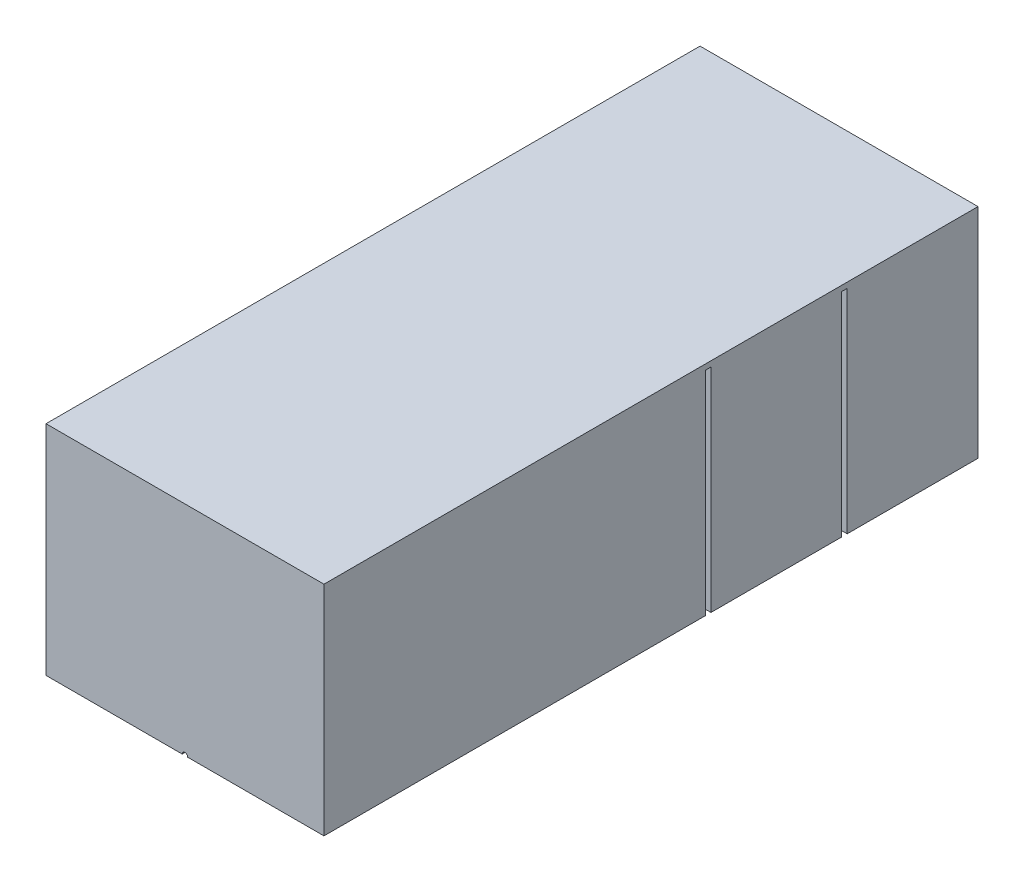
ISO-10303-21;
HEADER;
FILE_DESCRIPTION(('STEP AP214'),'2;1');
FILE_NAME('part.step','',(''),(''),'','','');
FILE_SCHEMA(('AUTOMOTIVE_DESIGN { 1 0 10303 214 1 1 1 1 }'));
ENDSEC;
DATA;
#1=APPLICATION_CONTEXT('core data for automotive mechanical design processes');
#2=APPLICATION_PROTOCOL_DEFINITION('international standard','automotive_design',2000,#1);
#3=PRODUCT_CONTEXT('',#1,'mechanical');
#4=PRODUCT('Part','Part','',(#3));
#5=PRODUCT_RELATED_PRODUCT_CATEGORY('part','',(#4));
#6=PRODUCT_DEFINITION_FORMATION('','',#4);
#7=PRODUCT_DEFINITION_CONTEXT('part definition',#1,'design');
#8=PRODUCT_DEFINITION('design','',#6,#7);
#9=PRODUCT_DEFINITION_SHAPE('','',#8);
#10=(LENGTH_UNIT() NAMED_UNIT(*) SI_UNIT(.MILLI.,.METRE.));
#11=(NAMED_UNIT(*) PLANE_ANGLE_UNIT() SI_UNIT($,.RADIAN.));
#12=(NAMED_UNIT(*) SI_UNIT($,.STERADIAN.) SOLID_ANGLE_UNIT());
#13=UNCERTAINTY_MEASURE_WITH_UNIT(LENGTH_MEASURE(1.E-05),#10,'distance_accuracy_value','');
#14=(GEOMETRIC_REPRESENTATION_CONTEXT(3) GLOBAL_UNCERTAINTY_ASSIGNED_CONTEXT((#13)) GLOBAL_UNIT_ASSIGNED_CONTEXT((#10,
#11,#12)) REPRESENTATION_CONTEXT('',''));
#15=CARTESIAN_POINT('',(0.,0.,0.));
#16=DIRECTION('',(0.,0.,1.));
#17=DIRECTION('',(1.,0.,0.));
#18=AXIS2_PLACEMENT_3D('',#15,#16,#17);
#19=CARTESIAN_POINT('',(56.,29.8959813156576,127.860636733485));
#20=DIRECTION('',(0.,1.,0.));
#21=DIRECTION('',(0.,0.,1.));
#22=AXIS2_PLACEMENT_3D('',#19,#20,#21);
#23=PLANE('',#22);
#24=DIRECTION('',(0.,0.,-1.));
#25=VECTOR('',#24,1.);
#26=CARTESIAN_POINT('',(107.,29.8959813156576,127.860636733485));
#27=LINE('',#26,#25);
#28=CARTESIAN_POINT('',(107.,29.8959813156576,31.8606367334853));
#29=VERTEX_POINT('',#28);
#30=CARTESIAN_POINT('',(107.,29.8959813156576,7.86063673348532));
#31=VERTEX_POINT('',#30);
#32=EDGE_CURVE('E409',#29,#31,#27,.T.);
#33=ORIENTED_EDGE('',*,*,#32,.F.);
#34=DIRECTION('',(1.,0.,0.));
#35=VECTOR('',#34,1.);
#36=CARTESIAN_POINT('',(107.,29.8959813156576,31.8606367334853));
#37=LINE('',#36,#35);
#38=CARTESIAN_POINT('',(56.,29.8959813156576,31.8606367334853));
#39=VERTEX_POINT('',#38);
#40=EDGE_CURVE('E233',#39,#29,#37,.T.);
#41=ORIENTED_EDGE('',*,*,#40,.F.);
#42=DIRECTION('',(0.,0.,-1.));
#43=VECTOR('',#42,1.);
#44=CARTESIAN_POINT('',(56.,29.8959813156576,127.860636733485));
#45=LINE('',#44,#43);
#46=CARTESIAN_POINT('',(56.,29.8959813156576,7.86063673348532));
#47=VERTEX_POINT('',#46);
#48=EDGE_CURVE('E53',#39,#47,#45,.T.);
#49=ORIENTED_EDGE('',*,*,#48,.T.);
#50=DIRECTION('',(1.,0.,0.));
#51=VECTOR('',#50,1.);
#52=CARTESIAN_POINT('',(56.,29.8959813156576,7.86063673348532));
#53=LINE('',#52,#51);
#54=EDGE_CURVE('E399',#47,#31,#53,.T.);
#55=ORIENTED_EDGE('',*,*,#54,.T.);
#56=EDGE_LOOP('',(#33,#41,#49,#55));
#57=FACE_BOUND('',#56,.T.);
#58=ADVANCED_FACE('F44',(#57),#23,.F.);
#59=CARTESIAN_POINT('',(56.,29.8959813156576,56.8606367334853));
#60=VERTEX_POINT('',#59);
#61=CARTESIAN_POINT('',(56.,29.8959813156576,32.8606367334853));
#62=VERTEX_POINT('',#61);
#63=EDGE_CURVE('E52',#60,#62,#45,.T.);
#64=ORIENTED_EDGE('',*,*,#63,.T.);
#65=DIRECTION('',(-1.,0.,0.));
#66=VECTOR('',#65,1.);
#67=CARTESIAN_POINT('',(107.,29.8959813156576,32.8606367334853));
#68=LINE('',#67,#66);
#69=CARTESIAN_POINT('',(107.,29.8959813156576,32.8606367334853));
#70=VERTEX_POINT('',#69);
#71=EDGE_CURVE('E462',#70,#62,#68,.T.);
#72=ORIENTED_EDGE('',*,*,#71,.F.);
#73=CARTESIAN_POINT('',(107.,29.8959813156576,56.8606367334853));
#74=VERTEX_POINT('',#73);
#75=EDGE_CURVE('E239',#74,#70,#27,.T.);
#76=ORIENTED_EDGE('',*,*,#75,.F.);
#77=DIRECTION('',(1.,0.,0.));
#78=VECTOR('',#77,1.);
#79=CARTESIAN_POINT('',(107.,29.8959813156576,56.8606367334853));
#80=LINE('',#79,#78);
#81=EDGE_CURVE('E353',#60,#74,#80,.T.);
#82=ORIENTED_EDGE('',*,*,#81,.F.);
#83=EDGE_LOOP('',(#64,#72,#76,#82));
#84=FACE_BOUND('',#83,.T.);
#85=ADVANCED_FACE('F461',(#84),#23,.F.);
#86=DIRECTION('',(1.,0.,0.));
#87=VECTOR('',#86,1.);
#88=CARTESIAN_POINT('',(59.,29.8959813156576,72.8606367334853));
#89=LINE('',#88,#87);
#90=CARTESIAN_POINT('',(59.,29.8959813156576,72.8606367334853));
#91=VERTEX_POINT('',#90);
#92=CARTESIAN_POINT('',(78.,29.8959813156576,72.8606367334853));
#93=VERTEX_POINT('',#92);
#94=EDGE_CURVE('E332',#91,#93,#89,.T.);
#95=ORIENTED_EDGE('',*,*,#94,.F.);
#96=DIRECTION('',(0.,0.,-1.));
#97=VECTOR('',#96,1.);
#98=CARTESIAN_POINT('',(59.,29.8959813156576,100.415027005272));
#99=LINE('',#98,#97);
#100=CARTESIAN_POINT('',(59.,29.8959813156576,100.415027005272));
#101=VERTEX_POINT('',#100);
#102=EDGE_CURVE('E311',#101,#91,#99,.T.);
#103=ORIENTED_EDGE('',*,*,#102,.F.);
#104=DIRECTION('',(-1.,0.,0.));
#105=VECTOR('',#104,1.);
#106=CARTESIAN_POINT('',(59.,29.8959813156576,100.415027005272));
#107=LINE('',#106,#105);
#108=CARTESIAN_POINT('',(78.,29.8959813156576,100.415027005272));
#109=VERTEX_POINT('',#108);
#110=EDGE_CURVE('E321',#109,#101,#107,.T.);
#111=ORIENTED_EDGE('',*,*,#110,.F.);
#112=DIRECTION('',(0.,0.,1.));
#113=VECTOR('',#112,1.);
#114=CARTESIAN_POINT('',(78.,29.8959813156576,100.415027005272));
#115=LINE('',#114,#113);
#116=EDGE_CURVE('E335',#93,#109,#115,.T.);
#117=ORIENTED_EDGE('',*,*,#116,.F.);
#118=EDGE_LOOP('',(#95,#103,#111,#117));
#119=FACE_BOUND('',#118,.T.);
#120=CARTESIAN_POINT('',(56.,29.8959813156576,127.860636733485));
#121=VERTEX_POINT('',#120);
#122=CARTESIAN_POINT('',(56.,29.8959813156576,57.8606367334853));
#123=VERTEX_POINT('',#122);
#124=EDGE_CURVE('E11',#121,#123,#45,.T.);
#125=ORIENTED_EDGE('',*,*,#124,.T.);
#126=DIRECTION('',(-1.,0.,0.));
#127=VECTOR('',#126,1.);
#128=CARTESIAN_POINT('',(107.,29.8959813156576,57.8606367334853));
#129=LINE('',#128,#127);
#130=CARTESIAN_POINT('',(81.,29.8959813156576,57.8606367334853));
#131=VERTEX_POINT('',#130);
#132=EDGE_CURVE('E342',#131,#123,#129,.T.);
#133=ORIENTED_EDGE('',*,*,#132,.F.);
#134=DIRECTION('',(0.,0.,1.));
#135=VECTOR('',#134,1.);
#136=CARTESIAN_POINT('',(81.,29.8959813156576,57.8606367334853));
#137=LINE('',#136,#135);
#138=CARTESIAN_POINT('',(81.,29.8959813156576,127.860636733485));
#139=VERTEX_POINT('',#138);
#140=EDGE_CURVE('E380',#131,#139,#137,.T.);
#141=ORIENTED_EDGE('',*,*,#140,.T.);
#142=DIRECTION('',(1.,0.,0.));
#143=VECTOR('',#142,1.);
#144=CARTESIAN_POINT('',(56.,29.8959813156576,127.860636733485));
#145=LINE('',#144,#143);
#146=EDGE_CURVE('E389',#121,#139,#145,.T.);
#147=ORIENTED_EDGE('',*,*,#146,.F.);
#148=EDGE_LOOP('',(#125,#133,#141,#147));
#149=FACE_BOUND('',#148,.T.);
#150=ADVANCED_FACE('F448',(#119,#149),#23,.F.);
#151=CARTESIAN_POINT('',(56.,69.8959813156576,127.860636733485));
#152=DIRECTION('',(1.,0.,0.));
#153=DIRECTION('',(0.,1.,0.));
#154=AXIS2_PLACEMENT_3D('',#151,#152,#153);
#155=PLANE('',#154);
#156=ORIENTED_EDGE('',*,*,#48,.F.);
#157=DIRECTION('',(0.,-1.,0.));
#158=VECTOR('',#157,1.);
#159=CARTESIAN_POINT('',(56.,68.8959813156576,31.8606367334853));
#160=LINE('',#159,#158);
#161=CARTESIAN_POINT('',(56.,68.8959813156576,31.8606367334853));
#162=VERTEX_POINT('',#161);
#163=EDGE_CURVE('E241',#162,#39,#160,.T.);
#164=ORIENTED_EDGE('',*,*,#163,.F.);
#165=DIRECTION('',(0.,0.,-1.));
#166=VECTOR('',#165,1.);
#167=CARTESIAN_POINT('',(56.,68.8959813156576,32.8606367334853));
#168=LINE('',#167,#166);
#169=CARTESIAN_POINT('',(56.,68.8959813156576,32.8606367334853));
#170=VERTEX_POINT('',#169);
#171=EDGE_CURVE('E226',#170,#162,#168,.T.);
#172=ORIENTED_EDGE('',*,*,#171,.F.);
#173=DIRECTION('',(0.,-1.,0.));
#174=VECTOR('',#173,1.);
#175=CARTESIAN_POINT('',(56.,68.8959813156576,32.8606367334853));
#176=LINE('',#175,#174);
#177=EDGE_CURVE('E224',#170,#62,#176,.T.);
#178=ORIENTED_EDGE('',*,*,#177,.T.);
#179=ORIENTED_EDGE('',*,*,#63,.F.);
#180=DIRECTION('',(0.,-1.,0.));
#181=VECTOR('',#180,1.);
#182=CARTESIAN_POINT('',(56.,68.8959813156576,56.8606367334853));
#183=LINE('',#182,#181);
#184=CARTESIAN_POINT('',(56.,68.8959813156576,56.8606367334853));
#185=VERTEX_POINT('',#184);
#186=EDGE_CURVE('E368',#185,#60,#183,.T.);
#187=ORIENTED_EDGE('',*,*,#186,.F.);
#188=DIRECTION('',(0.,0.,-1.));
#189=VECTOR('',#188,1.);
#190=CARTESIAN_POINT('',(56.,68.8959813156576,57.8606367334853));
#191=LINE('',#190,#189);
#192=CARTESIAN_POINT('',(56.,68.8959813156576,57.8606367334853));
#193=VERTEX_POINT('',#192);
#194=EDGE_CURVE('E356',#193,#185,#191,.T.);
#195=ORIENTED_EDGE('',*,*,#194,.F.);
#196=DIRECTION('',(0.,-1.,0.));
#197=VECTOR('',#196,1.);
#198=CARTESIAN_POINT('',(56.,68.8959813156576,57.8606367334853));
#199=LINE('',#198,#197);
#200=EDGE_CURVE('E370',#193,#123,#199,.T.);
#201=ORIENTED_EDGE('',*,*,#200,.T.);
#202=ORIENTED_EDGE('',*,*,#124,.F.);
#203=DIRECTION('',(0.,-1.,0.));
#204=VECTOR('',#203,1.);
#205=CARTESIAN_POINT('',(56.,69.8959813156576,127.860636733485));
#206=LINE('',#205,#204);
#207=CARTESIAN_POINT('',(56.,69.8959813156576,127.860636733485));
#208=VERTEX_POINT('',#207);
#209=EDGE_CURVE('E384',#208,#121,#206,.T.);
#210=ORIENTED_EDGE('',*,*,#209,.F.);
#211=DIRECTION('',(0.,0.,-1.));
#212=VECTOR('',#211,1.);
#213=CARTESIAN_POINT('',(56.,69.8959813156576,127.860636733485));
#214=LINE('',#213,#212);
#215=CARTESIAN_POINT('',(56.,69.8959813156576,7.86063673348532));
#216=VERTEX_POINT('',#215);
#217=EDGE_CURVE('E396',#208,#216,#214,.T.);
#218=ORIENTED_EDGE('',*,*,#217,.T.);
#219=DIRECTION('',(0.,-1.,0.));
#220=VECTOR('',#219,1.);
#221=CARTESIAN_POINT('',(56.,69.8959813156576,7.86063673348532));
#222=LINE('',#221,#220);
#223=EDGE_CURVE('E383',#216,#47,#222,.T.);
#224=ORIENTED_EDGE('',*,*,#223,.T.);
#225=EDGE_LOOP('',(#156,#164,#172,#178,#179,#187,#195,#201,#202,#210,#218,#224));
#226=FACE_BOUND('',#225,.T.);
#227=ADVANCED_FACE('F46',(#226),#155,.F.);
#228=DIRECTION('',(1.,0.,0.));
#229=VECTOR('',#228,1.);
#230=CARTESIAN_POINT('',(84.5,29.8959813156576,72.3606367334853));
#231=LINE('',#230,#229);
#232=CARTESIAN_POINT('',(84.5,29.8959813156576,72.3606367334853));
#233=VERTEX_POINT('',#232);
#234=CARTESIAN_POINT('',(104.5,29.8959813156576,72.3606367334853));
#235=VERTEX_POINT('',#234);
#236=EDGE_CURVE('E301',#233,#235,#231,.T.);
#237=ORIENTED_EDGE('',*,*,#236,.F.);
#238=DIRECTION('',(0.,0.,-1.));
#239=VECTOR('',#238,1.);
#240=CARTESIAN_POINT('',(84.5,29.8959813156576,100.915398132448));
#241=LINE('',#240,#239);
#242=CARTESIAN_POINT('',(84.5,29.8959813156576,100.915398132448));
#243=VERTEX_POINT('',#242);
#244=EDGE_CURVE('E68',#243,#233,#241,.T.);
#245=ORIENTED_EDGE('',*,*,#244,.F.);
#246=DIRECTION('',(-1.,0.,0.));
#247=VECTOR('',#246,1.);
#248=CARTESIAN_POINT('',(84.5,29.8959813156576,100.915398132448));
#249=LINE('',#248,#247);
#250=CARTESIAN_POINT('',(104.5,29.8959813156576,100.915398132448));
#251=VERTEX_POINT('',#250);
#252=EDGE_CURVE('E290',#251,#243,#249,.T.);
#253=ORIENTED_EDGE('',*,*,#252,.F.);
#254=DIRECTION('',(0.,0.,1.));
#255=VECTOR('',#254,1.);
#256=CARTESIAN_POINT('',(104.5,29.8959813156576,100.915398132448));
#257=LINE('',#256,#255);
#258=EDGE_CURVE('E304',#235,#251,#257,.T.);
#259=ORIENTED_EDGE('',*,*,#258,.F.);
#260=EDGE_LOOP('',(#237,#245,#253,#259));
#261=FACE_BOUND('',#260,.T.);
#262=DIRECTION('',(0.,0.,1.));
#263=VECTOR('',#262,1.);
#264=CARTESIAN_POINT('',(82.,29.8959813156576,57.8606367334853));
#265=LINE('',#264,#263);
#266=CARTESIAN_POINT('',(82.,29.8959813156576,127.860636733485));
#267=VERTEX_POINT('',#266);
#268=CARTESIAN_POINT('',(82.,29.8959813156576,57.8606367334853));
#269=VERTEX_POINT('',#268);
#270=EDGE_CURVE('E376',#267,#269,#265,.F.);
#271=ORIENTED_EDGE('',*,*,#270,.T.);
#272=CARTESIAN_POINT('',(107.,29.8959813156576,57.8606367334853));
#273=VERTEX_POINT('',#272);
#274=EDGE_CURVE('E362',#273,#269,#129,.T.);
#275=ORIENTED_EDGE('',*,*,#274,.F.);
#276=CARTESIAN_POINT('',(107.,29.8959813156576,127.860636733485));
#277=VERTEX_POINT('',#276);
#278=EDGE_CURVE('E410',#277,#273,#27,.T.);
#279=ORIENTED_EDGE('',*,*,#278,.F.);
#280=EDGE_CURVE('E387',#267,#277,#145,.T.);
#281=ORIENTED_EDGE('',*,*,#280,.F.);
#282=EDGE_LOOP('',(#271,#275,#279,#281));
#283=FACE_BOUND('',#282,.T.);
#284=ADVANCED_FACE('F439',(#261,#283),#23,.F.);
#285=CARTESIAN_POINT('',(107.,69.8959813156576,127.860636733485));
#286=DIRECTION('',(-1.,0.,0.));
#287=DIRECTION('',(0.,-1.,0.));
#288=AXIS2_PLACEMENT_3D('',#285,#286,#287);
#289=PLANE('',#288);
#290=DIRECTION('',(0.,0.,1.));
#291=VECTOR('',#290,1.);
#292=CARTESIAN_POINT('',(107.,68.8959813156576,32.8606367334853));
#293=LINE('',#292,#291);
#294=CARTESIAN_POINT('',(107.,68.8959813156576,31.8606367334853));
#295=VERTEX_POINT('',#294);
#296=CARTESIAN_POINT('',(107.,68.8959813156576,32.8606367334853));
#297=VERTEX_POINT('',#296);
#298=EDGE_CURVE('E227',#295,#297,#293,.T.);
#299=ORIENTED_EDGE('',*,*,#298,.F.);
#300=DIRECTION('',(0.,-1.,0.));
#301=VECTOR('',#300,1.);
#302=CARTESIAN_POINT('',(107.,68.8959813156576,31.8606367334853));
#303=LINE('',#302,#301);
#304=EDGE_CURVE('E253',#295,#29,#303,.T.);
#305=ORIENTED_EDGE('',*,*,#304,.T.);
#306=ORIENTED_EDGE('',*,*,#32,.T.);
#307=DIRECTION('',(0.,1.,0.));
#308=VECTOR('',#307,1.);
#309=CARTESIAN_POINT('',(107.,69.8959813156576,7.86063673348532));
#310=LINE('',#309,#308);
#311=CARTESIAN_POINT('',(107.,69.8959813156576,7.86063673348532));
#312=VERTEX_POINT('',#311);
#313=EDGE_CURVE('E402',#31,#312,#310,.T.);
#314=ORIENTED_EDGE('',*,*,#313,.T.);
#315=DIRECTION('',(0.,0.,-1.));
#316=VECTOR('',#315,1.);
#317=CARTESIAN_POINT('',(107.,69.8959813156576,127.860636733485));
#318=LINE('',#317,#316);
#319=CARTESIAN_POINT('',(107.,69.8959813156576,127.860636733485));
#320=VERTEX_POINT('',#319);
#321=EDGE_CURVE('E407',#320,#312,#318,.T.);
#322=ORIENTED_EDGE('',*,*,#321,.F.);
#323=DIRECTION('',(0.,1.,0.));
#324=VECTOR('',#323,1.);
#325=CARTESIAN_POINT('',(107.,69.8959813156576,127.860636733485));
#326=LINE('',#325,#324);
#327=EDGE_CURVE('E392',#277,#320,#326,.T.);
#328=ORIENTED_EDGE('',*,*,#327,.F.);
#329=ORIENTED_EDGE('',*,*,#278,.T.);
#330=DIRECTION('',(0.,-1.,0.));
#331=VECTOR('',#330,1.);
#332=CARTESIAN_POINT('',(107.,68.8959813156576,57.8606367334853));
#333=LINE('',#332,#331);
#334=CARTESIAN_POINT('',(107.,68.8959813156576,57.8606367334853));
#335=VERTEX_POINT('',#334);
#336=EDGE_CURVE('E361',#335,#273,#333,.T.);
#337=ORIENTED_EDGE('',*,*,#336,.F.);
#338=DIRECTION('',(0.,0.,1.));
#339=VECTOR('',#338,1.);
#340=CARTESIAN_POINT('',(107.,68.8959813156576,57.8606367334853));
#341=LINE('',#340,#339);
#342=CARTESIAN_POINT('',(107.,68.8959813156576,56.8606367334853));
#343=VERTEX_POINT('',#342);
#344=EDGE_CURVE('E349',#343,#335,#341,.T.);
#345=ORIENTED_EDGE('',*,*,#344,.F.);
#346=DIRECTION('',(0.,-1.,0.));
#347=VECTOR('',#346,1.);
#348=CARTESIAN_POINT('',(107.,68.8959813156576,56.8606367334853));
#349=LINE('',#348,#347);
#350=EDGE_CURVE('E365',#343,#74,#349,.T.);
#351=ORIENTED_EDGE('',*,*,#350,.T.);
#352=ORIENTED_EDGE('',*,*,#75,.T.);
#353=DIRECTION('',(0.,-1.,0.));
#354=VECTOR('',#353,1.);
#355=CARTESIAN_POINT('',(107.,68.8959813156576,32.8606367334853));
#356=LINE('',#355,#354);
#357=EDGE_CURVE('E221',#297,#70,#356,.T.);
#358=ORIENTED_EDGE('',*,*,#357,.F.);
#359=EDGE_LOOP('',(#299,#305,#306,#314,#322,#328,#329,#337,#345,#351,#352,#358));
#360=FACE_BOUND('',#359,.T.);
#361=ADVANCED_FACE('F236',(#360),#289,.F.);
#362=CARTESIAN_POINT('',(56.,69.8959813156576,127.860636733485));
#363=DIRECTION('',(0.,-1.,0.));
#364=DIRECTION('',(0.,0.,-1.));
#365=AXIS2_PLACEMENT_3D('',#362,#363,#364);
#366=PLANE('',#365);
#367=DIRECTION('',(-1.,0.,0.));
#368=VECTOR('',#367,1.);
#369=CARTESIAN_POINT('',(56.,69.8959813156576,7.86063673348532));
#370=LINE('',#369,#368);
#371=EDGE_CURVE('E388',#312,#216,#370,.T.);
#372=ORIENTED_EDGE('',*,*,#371,.T.);
#373=ORIENTED_EDGE('',*,*,#217,.F.);
#374=DIRECTION('',(-1.,0.,0.));
#375=VECTOR('',#374,1.);
#376=CARTESIAN_POINT('',(56.,69.8959813156576,127.860636733485));
#377=LINE('',#376,#375);
#378=EDGE_CURVE('E394',#320,#208,#377,.T.);
#379=ORIENTED_EDGE('',*,*,#378,.F.);
#380=ORIENTED_EDGE('',*,*,#321,.T.);
#381=EDGE_LOOP('',(#372,#373,#379,#380));
#382=FACE_BOUND('',#381,.T.);
#383=ADVANCED_FACE('F428',(#382),#366,.F.);
#384=CARTESIAN_POINT('',(0.,0.,127.860636733485));
#385=DIRECTION('',(0.,0.,1.));
#386=DIRECTION('',(1.,0.,0.));
#387=AXIS2_PLACEMENT_3D('',#384,#385,#386);
#388=PLANE('',#387);
#389=CARTESIAN_POINT('',(81.5,29.8959813156576,127.860636733485));
#390=DIRECTION('',(0.,0.,1.));
#391=DIRECTION('',(1.,0.,0.));
#392=AXIS2_PLACEMENT_3D('',#389,#390,#391);
#393=CIRCLE('',#392,0.499999999999999);
#394=EDGE_CURVE('E367',#267,#139,#393,.T.);
#395=ORIENTED_EDGE('',*,*,#394,.F.);
#396=ORIENTED_EDGE('',*,*,#280,.T.);
#397=ORIENTED_EDGE('',*,*,#327,.T.);
#398=ORIENTED_EDGE('',*,*,#378,.T.);
#399=ORIENTED_EDGE('',*,*,#209,.T.);
#400=ORIENTED_EDGE('',*,*,#146,.T.);
#401=EDGE_LOOP('',(#395,#396,#397,#398,#399,#400));
#402=FACE_BOUND('',#401,.T.);
#403=ADVANCED_FACE('F435',(#402),#388,.T.);
#404=CARTESIAN_POINT('',(0.,0.,7.86063673348532));
#405=DIRECTION('',(0.,0.,1.));
#406=DIRECTION('',(1.,0.,0.));
#407=AXIS2_PLACEMENT_3D('',#404,#405,#406);
#408=PLANE('',#407);
#409=ORIENTED_EDGE('',*,*,#223,.F.);
#410=ORIENTED_EDGE('',*,*,#371,.F.);
#411=ORIENTED_EDGE('',*,*,#313,.F.);
#412=ORIENTED_EDGE('',*,*,#54,.F.);
#413=EDGE_LOOP('',(#409,#410,#411,#412));
#414=FACE_BOUND('',#413,.T.);
#415=ADVANCED_FACE('F425',(#414),#408,.F.);
#416=CARTESIAN_POINT('',(81.5,29.8959813156576,57.8606367334853));
#417=DIRECTION('',(0.,0.,1.));
#418=DIRECTION('',(1.,0.,0.));
#419=AXIS2_PLACEMENT_3D('',#416,#417,#418);
#420=CYLINDRICAL_SURFACE('',#419,0.499999999999999);
#421=CARTESIAN_POINT('',(81.5,29.8959813156576,57.8606367334853));
#422=DIRECTION('',(0.,0.,1.));
#423=DIRECTION('',(1.,0.,0.));
#424=AXIS2_PLACEMENT_3D('',#421,#422,#423);
#425=CIRCLE('',#424,0.499999999999999);
#426=EDGE_CURVE('E374',#269,#131,#425,.T.);
#427=ORIENTED_EDGE('',*,*,#426,.F.);
#428=ORIENTED_EDGE('',*,*,#270,.F.);
#429=ORIENTED_EDGE('',*,*,#394,.T.);
#430=ORIENTED_EDGE('',*,*,#140,.F.);
#431=EDGE_LOOP('',(#427,#428,#429,#430));
#432=FACE_BOUND('',#431,.T.);
#433=ADVANCED_FACE('F446',(#432),#420,.F.);
#434=CARTESIAN_POINT('',(107.,68.8959813156576,57.8606367334853));
#435=DIRECTION('',(0.,0.,1.));
#436=DIRECTION('',(1.,0.,0.));
#437=AXIS2_PLACEMENT_3D('',#434,#435,#436);
#438=PLANE('',#437);
#439=ORIENTED_EDGE('',*,*,#132,.T.);
#440=ORIENTED_EDGE('',*,*,#200,.F.);
#441=DIRECTION('',(-1.,0.,0.));
#442=VECTOR('',#441,1.);
#443=CARTESIAN_POINT('',(107.,68.8959813156576,57.8606367334853));
#444=LINE('',#443,#442);
#445=EDGE_CURVE('E352',#335,#193,#444,.T.);
#446=ORIENTED_EDGE('',*,*,#445,.F.);
#447=ORIENTED_EDGE('',*,*,#336,.T.);
#448=ORIENTED_EDGE('',*,*,#274,.T.);
#449=ORIENTED_EDGE('',*,*,#426,.T.);
#450=EDGE_LOOP('',(#439,#440,#446,#447,#448,#449));
#451=FACE_BOUND('',#450,.T.);
#452=ADVANCED_FACE('F442',(#451),#438,.F.);
#453=CARTESIAN_POINT('',(107.,68.8959813156576,56.8606367334853));
#454=DIRECTION('',(0.,0.,-1.));
#455=DIRECTION('',(-1.,0.,0.));
#456=AXIS2_PLACEMENT_3D('',#453,#454,#455);
#457=PLANE('',#456);
#458=ORIENTED_EDGE('',*,*,#81,.T.);
#459=ORIENTED_EDGE('',*,*,#350,.F.);
#460=DIRECTION('',(1.,0.,0.));
#461=VECTOR('',#460,1.);
#462=CARTESIAN_POINT('',(107.,68.8959813156576,56.8606367334853));
#463=LINE('',#462,#461);
#464=EDGE_CURVE('E358',#185,#343,#463,.T.);
#465=ORIENTED_EDGE('',*,*,#464,.F.);
#466=ORIENTED_EDGE('',*,*,#186,.T.);
#467=EDGE_LOOP('',(#458,#459,#465,#466));
#468=FACE_BOUND('',#467,.T.);
#469=ADVANCED_FACE('F457',(#468),#457,.F.);
#470=CARTESIAN_POINT('',(0.,68.8959813156576,0.));
#471=DIRECTION('',(0.,1.,0.));
#472=DIRECTION('',(0.,0.,1.));
#473=AXIS2_PLACEMENT_3D('',#470,#471,#472);
#474=PLANE('',#473);
#475=ORIENTED_EDGE('',*,*,#344,.T.);
#476=ORIENTED_EDGE('',*,*,#445,.T.);
#477=ORIENTED_EDGE('',*,*,#194,.T.);
#478=ORIENTED_EDGE('',*,*,#464,.T.);
#479=EDGE_LOOP('',(#475,#476,#477,#478));
#480=FACE_BOUND('',#479,.T.);
#481=ADVANCED_FACE('F454',(#480),#474,.F.);
#482=CARTESIAN_POINT('',(59.,44.8959813156576,100.415027005272));
#483=DIRECTION('',(-1.,0.,0.));
#484=DIRECTION('',(0.,0.,1.));
#485=AXIS2_PLACEMENT_3D('',#482,#483,#484);
#486=PLANE('',#485);
#487=ORIENTED_EDGE('',*,*,#102,.T.);
#488=DIRECTION('',(0.,-1.,0.));
#489=VECTOR('',#488,1.);
#490=CARTESIAN_POINT('',(59.,44.8959813156576,72.8606367334853));
#491=LINE('',#490,#489);
#492=CARTESIAN_POINT('',(59.,44.8959813156576,72.8606367334853));
#493=VERTEX_POINT('',#492);
#494=EDGE_CURVE('E330',#493,#91,#491,.T.);
#495=ORIENTED_EDGE('',*,*,#494,.F.);
#496=DIRECTION('',(0.,0.,-1.));
#497=VECTOR('',#496,1.);
#498=CARTESIAN_POINT('',(59.,44.8959813156576,100.415027005272));
#499=LINE('',#498,#497);
#500=CARTESIAN_POINT('',(59.,44.8959813156576,100.415027005272));
#501=VERTEX_POINT('',#500);
#502=EDGE_CURVE('E317',#501,#493,#499,.T.);
#503=ORIENTED_EDGE('',*,*,#502,.F.);
#504=DIRECTION('',(0.,-1.,0.));
#505=VECTOR('',#504,1.);
#506=CARTESIAN_POINT('',(59.,44.8959813156576,100.415027005272));
#507=LINE('',#506,#505);
#508=EDGE_CURVE('E340',#501,#101,#507,.T.);
#509=ORIENTED_EDGE('',*,*,#508,.T.);
#510=EDGE_LOOP('',(#487,#495,#503,#509));
#511=FACE_BOUND('',#510,.T.);
#512=ADVANCED_FACE('F511',(#511),#486,.F.);
#513=CARTESIAN_POINT('',(59.,44.8959813156576,100.415027005272));
#514=DIRECTION('',(0.,0.,1.));
#515=DIRECTION('',(1.,0.,0.));
#516=AXIS2_PLACEMENT_3D('',#513,#514,#515);
#517=PLANE('',#516);
#518=ORIENTED_EDGE('',*,*,#110,.T.);
#519=ORIENTED_EDGE('',*,*,#508,.F.);
#520=DIRECTION('',(-1.,0.,0.));
#521=VECTOR('',#520,1.);
#522=CARTESIAN_POINT('',(59.,44.8959813156576,100.415027005272));
#523=LINE('',#522,#521);
#524=CARTESIAN_POINT('',(78.,44.8959813156576,100.415027005272));
#525=VERTEX_POINT('',#524);
#526=EDGE_CURVE('E327',#525,#501,#523,.T.);
#527=ORIENTED_EDGE('',*,*,#526,.F.);
#528=DIRECTION('',(0.,-1.,0.));
#529=VECTOR('',#528,1.);
#530=CARTESIAN_POINT('',(78.,44.8959813156576,100.415027005272));
#531=LINE('',#530,#529);
#532=EDGE_CURVE('E343',#525,#109,#531,.T.);
#533=ORIENTED_EDGE('',*,*,#532,.T.);
#534=EDGE_LOOP('',(#518,#519,#527,#533));
#535=FACE_BOUND('',#534,.T.);
#536=ADVANCED_FACE('F514',(#535),#517,.F.);
#537=CARTESIAN_POINT('',(78.,44.8959813156576,100.415027005272));
#538=DIRECTION('',(1.,0.,0.));
#539=DIRECTION('',(0.,0.,-1.));
#540=AXIS2_PLACEMENT_3D('',#537,#538,#539);
#541=PLANE('',#540);
#542=ORIENTED_EDGE('',*,*,#116,.T.);
#543=ORIENTED_EDGE('',*,*,#532,.F.);
#544=DIRECTION('',(0.,0.,1.));
#545=VECTOR('',#544,1.);
#546=CARTESIAN_POINT('',(78.,44.8959813156576,100.415027005272));
#547=LINE('',#546,#545);
#548=CARTESIAN_POINT('',(78.,44.8959813156576,72.8606367334853));
#549=VERTEX_POINT('',#548);
#550=EDGE_CURVE('E324',#549,#525,#547,.T.);
#551=ORIENTED_EDGE('',*,*,#550,.F.);
#552=DIRECTION('',(0.,-1.,0.));
#553=VECTOR('',#552,1.);
#554=CARTESIAN_POINT('',(78.,44.8959813156576,72.8606367334853));
#555=LINE('',#554,#553);
#556=EDGE_CURVE('E345',#549,#93,#555,.T.);
#557=ORIENTED_EDGE('',*,*,#556,.T.);
#558=EDGE_LOOP('',(#542,#543,#551,#557));
#559=FACE_BOUND('',#558,.T.);
#560=ADVANCED_FACE('F516',(#559),#541,.F.);
#561=CARTESIAN_POINT('',(59.,44.8959813156576,72.8606367334853));
#562=DIRECTION('',(0.,0.,-1.));
#563=DIRECTION('',(-1.,0.,0.));
#564=AXIS2_PLACEMENT_3D('',#561,#562,#563);
#565=PLANE('',#564);
#566=ORIENTED_EDGE('',*,*,#94,.T.);
#567=ORIENTED_EDGE('',*,*,#556,.F.);
#568=DIRECTION('',(1.,0.,0.));
#569=VECTOR('',#568,1.);
#570=CARTESIAN_POINT('',(59.,44.8959813156576,72.8606367334853));
#571=LINE('',#570,#569);
#572=EDGE_CURVE('E320',#493,#549,#571,.T.);
#573=ORIENTED_EDGE('',*,*,#572,.F.);
#574=ORIENTED_EDGE('',*,*,#494,.T.);
#575=EDGE_LOOP('',(#566,#567,#573,#574));
#576=FACE_BOUND('',#575,.T.);
#577=ADVANCED_FACE('F506',(#576),#565,.F.);
#578=CARTESIAN_POINT('',(0.,44.8959813156576,0.));
#579=DIRECTION('',(0.,-1.,0.));
#580=DIRECTION('',(0.,0.,-1.));
#581=AXIS2_PLACEMENT_3D('',#578,#579,#580);
#582=PLANE('',#581);
#583=ORIENTED_EDGE('',*,*,#502,.T.);
#584=ORIENTED_EDGE('',*,*,#572,.T.);
#585=ORIENTED_EDGE('',*,*,#550,.T.);
#586=ORIENTED_EDGE('',*,*,#526,.T.);
#587=EDGE_LOOP('',(#583,#584,#585,#586));
#588=FACE_BOUND('',#587,.T.);
#589=ADVANCED_FACE('F518',(#588),#582,.T.);
#590=CARTESIAN_POINT('',(84.5,30.8959813156576,100.915398132448));
#591=DIRECTION('',(-1.,0.,0.));
#592=DIRECTION('',(0.,0.,1.));
#593=AXIS2_PLACEMENT_3D('',#590,#591,#592);
#594=PLANE('',#593);
#595=ORIENTED_EDGE('',*,*,#244,.T.);
#596=DIRECTION('',(0.,-1.,0.));
#597=VECTOR('',#596,1.);
#598=CARTESIAN_POINT('',(84.5,30.8959813156576,72.3606367334853));
#599=LINE('',#598,#597);
#600=CARTESIAN_POINT('',(84.5,30.8959813156576,72.3606367334853));
#601=VERTEX_POINT('',#600);
#602=EDGE_CURVE('E299',#601,#233,#599,.T.);
#603=ORIENTED_EDGE('',*,*,#602,.F.);
#604=DIRECTION('',(0.,0.,-1.));
#605=VECTOR('',#604,1.);
#606=CARTESIAN_POINT('',(84.5,30.8959813156576,100.915398132448));
#607=LINE('',#606,#605);
#608=CARTESIAN_POINT('',(84.5,30.8959813156576,100.915398132448));
#609=VERTEX_POINT('',#608);
#610=EDGE_CURVE('E286',#609,#601,#607,.T.);
#611=ORIENTED_EDGE('',*,*,#610,.F.);
#612=DIRECTION('',(0.,-1.,0.));
#613=VECTOR('',#612,1.);
#614=CARTESIAN_POINT('',(84.5,30.8959813156576,100.915398132448));
#615=LINE('',#614,#613);
#616=EDGE_CURVE('E309',#609,#243,#615,.T.);
#617=ORIENTED_EDGE('',*,*,#616,.T.);
#618=EDGE_LOOP('',(#595,#603,#611,#617));
#619=FACE_BOUND('',#618,.T.);
#620=ADVANCED_FACE('F520',(#619),#594,.F.);
#621=CARTESIAN_POINT('',(84.5,30.8959813156576,100.915398132448));
#622=DIRECTION('',(0.,0.,1.));
#623=DIRECTION('',(1.,0.,0.));
#624=AXIS2_PLACEMENT_3D('',#621,#622,#623);
#625=PLANE('',#624);
#626=ORIENTED_EDGE('',*,*,#252,.T.);
#627=ORIENTED_EDGE('',*,*,#616,.F.);
#628=DIRECTION('',(-1.,0.,0.));
#629=VECTOR('',#628,1.);
#630=CARTESIAN_POINT('',(84.5,30.8959813156576,100.915398132448));
#631=LINE('',#630,#629);
#632=CARTESIAN_POINT('',(104.5,30.8959813156576,100.915398132448));
#633=VERTEX_POINT('',#632);
#634=EDGE_CURVE('E296',#633,#609,#631,.T.);
#635=ORIENTED_EDGE('',*,*,#634,.F.);
#636=DIRECTION('',(0.,-1.,0.));
#637=VECTOR('',#636,1.);
#638=CARTESIAN_POINT('',(104.5,30.8959813156576,100.915398132448));
#639=LINE('',#638,#637);
#640=EDGE_CURVE('E312',#633,#251,#639,.T.);
#641=ORIENTED_EDGE('',*,*,#640,.T.);
#642=EDGE_LOOP('',(#626,#627,#635,#641));
#643=FACE_BOUND('',#642,.T.);
#644=ADVANCED_FACE('F526',(#643),#625,.F.);
#645=CARTESIAN_POINT('',(104.5,30.8959813156576,100.915398132448));
#646=DIRECTION('',(1.,0.,0.));
#647=DIRECTION('',(0.,0.,-1.));
#648=AXIS2_PLACEMENT_3D('',#645,#646,#647);
#649=PLANE('',#648);
#650=ORIENTED_EDGE('',*,*,#258,.T.);
#651=ORIENTED_EDGE('',*,*,#640,.F.);
#652=DIRECTION('',(0.,0.,1.));
#653=VECTOR('',#652,1.);
#654=CARTESIAN_POINT('',(104.5,30.8959813156576,100.915398132448));
#655=LINE('',#654,#653);
#656=CARTESIAN_POINT('',(104.5,30.8959813156576,72.3606367334853));
#657=VERTEX_POINT('',#656);
#658=EDGE_CURVE('E293',#657,#633,#655,.T.);
#659=ORIENTED_EDGE('',*,*,#658,.F.);
#660=DIRECTION('',(0.,-1.,0.));
#661=VECTOR('',#660,1.);
#662=CARTESIAN_POINT('',(104.5,30.8959813156576,72.3606367334853));
#663=LINE('',#662,#661);
#664=EDGE_CURVE('E314',#657,#235,#663,.T.);
#665=ORIENTED_EDGE('',*,*,#664,.T.);
#666=EDGE_LOOP('',(#650,#651,#659,#665));
#667=FACE_BOUND('',#666,.T.);
#668=ADVANCED_FACE('F627',(#667),#649,.F.);
#669=CARTESIAN_POINT('',(84.5,30.8959813156576,72.3606367334853));
#670=DIRECTION('',(0.,0.,-1.));
#671=DIRECTION('',(-1.,0.,0.));
#672=AXIS2_PLACEMENT_3D('',#669,#670,#671);
#673=PLANE('',#672);
#674=ORIENTED_EDGE('',*,*,#236,.T.);
#675=ORIENTED_EDGE('',*,*,#664,.F.);
#676=DIRECTION('',(1.,0.,0.));
#677=VECTOR('',#676,1.);
#678=CARTESIAN_POINT('',(84.5,30.8959813156576,72.3606367334853));
#679=LINE('',#678,#677);
#680=EDGE_CURVE('E289',#601,#657,#679,.T.);
#681=ORIENTED_EDGE('',*,*,#680,.F.);
#682=ORIENTED_EDGE('',*,*,#602,.T.);
#683=EDGE_LOOP('',(#674,#675,#681,#682));
#684=FACE_BOUND('',#683,.T.);
#685=ADVANCED_FACE('F638',(#684),#673,.F.);
#686=CARTESIAN_POINT('',(0.,30.8959813156576,0.));
#687=DIRECTION('',(0.,-1.,0.));
#688=DIRECTION('',(0.,0.,-1.));
#689=AXIS2_PLACEMENT_3D('',#686,#687,#688);
#690=PLANE('',#689);
#691=DIRECTION('',(-1.,0.,0.));
#692=VECTOR('',#691,1.);
#693=CARTESIAN_POINT('',(85.,30.8959813156576,100.415398132448));
#694=LINE('',#693,#692);
#695=CARTESIAN_POINT('',(104.,30.8959813156576,100.415398132448));
#696=VERTEX_POINT('',#695);
#697=CARTESIAN_POINT('',(85.,30.8959813156576,100.415398132448));
#698=VERTEX_POINT('',#697);
#699=EDGE_CURVE('E264',#696,#698,#694,.T.);
#700=ORIENTED_EDGE('',*,*,#699,.F.);
#701=DIRECTION('',(0.,0.,1.));
#702=VECTOR('',#701,1.);
#703=CARTESIAN_POINT('',(104.,30.8959813156576,100.415398132448));
#704=LINE('',#703,#702);
#705=CARTESIAN_POINT('',(104.,30.8959813156576,72.8606367334853));
#706=VERTEX_POINT('',#705);
#707=EDGE_CURVE('E261',#706,#696,#704,.T.);
#708=ORIENTED_EDGE('',*,*,#707,.F.);
#709=DIRECTION('',(1.,0.,0.));
#710=VECTOR('',#709,1.);
#711=CARTESIAN_POINT('',(85.,30.8959813156576,72.8606367334853));
#712=LINE('',#711,#710);
#713=CARTESIAN_POINT('',(85.,30.8959813156576,72.8606367334853));
#714=VERTEX_POINT('',#713);
#715=EDGE_CURVE('E257',#714,#706,#712,.T.);
#716=ORIENTED_EDGE('',*,*,#715,.F.);
#717=DIRECTION('',(0.,0.,-1.));
#718=VECTOR('',#717,1.);
#719=CARTESIAN_POINT('',(85.,30.8959813156576,100.415398132448));
#720=LINE('',#719,#718);
#721=EDGE_CURVE('E254',#698,#714,#720,.T.);
#722=ORIENTED_EDGE('',*,*,#721,.F.);
#723=EDGE_LOOP('',(#700,#708,#716,#722));
#724=FACE_BOUND('',#723,.T.);
#725=ORIENTED_EDGE('',*,*,#610,.T.);
#726=ORIENTED_EDGE('',*,*,#680,.T.);
#727=ORIENTED_EDGE('',*,*,#658,.T.);
#728=ORIENTED_EDGE('',*,*,#634,.T.);
#729=EDGE_LOOP('',(#725,#726,#727,#728));
#730=FACE_BOUND('',#729,.T.);
#731=ADVANCED_FACE('F649',(#724,#730),#690,.T.);
#732=CARTESIAN_POINT('',(85.,30.8959813156576,100.415398132448));
#733=DIRECTION('',(-1.,0.,0.));
#734=DIRECTION('',(0.,0.,1.));
#735=AXIS2_PLACEMENT_3D('',#732,#733,#734);
#736=PLANE('',#735);
#737=DIRECTION('',(0.,0.,-1.));
#738=VECTOR('',#737,1.);
#739=CARTESIAN_POINT('',(85.,29.8959813156576,100.415398132448));
#740=LINE('',#739,#738);
#741=CARTESIAN_POINT('',(85.,29.8959813156576,100.415398132448));
#742=VERTEX_POINT('',#741);
#743=CARTESIAN_POINT('',(85.,29.8959813156576,72.8606367334853));
#744=VERTEX_POINT('',#743);
#745=EDGE_CURVE('E249',#742,#744,#740,.T.);
#746=ORIENTED_EDGE('',*,*,#745,.F.);
#747=DIRECTION('',(0.,-1.,0.));
#748=VECTOR('',#747,1.);
#749=CARTESIAN_POINT('',(85.,30.8959813156576,100.415398132448));
#750=LINE('',#749,#748);
#751=EDGE_CURVE('E278',#698,#742,#750,.T.);
#752=ORIENTED_EDGE('',*,*,#751,.F.);
#753=ORIENTED_EDGE('',*,*,#721,.T.);
#754=DIRECTION('',(0.,-1.,0.));
#755=VECTOR('',#754,1.);
#756=CARTESIAN_POINT('',(85.,30.8959813156576,72.8606367334853));
#757=LINE('',#756,#755);
#758=EDGE_CURVE('E267',#714,#744,#757,.T.);
#759=ORIENTED_EDGE('',*,*,#758,.T.);
#760=EDGE_LOOP('',(#746,#752,#753,#759));
#761=FACE_BOUND('',#760,.T.);
#762=ADVANCED_FACE('F659',(#761),#736,.T.);
#763=CARTESIAN_POINT('',(85.,30.8959813156576,100.415398132448));
#764=DIRECTION('',(0.,0.,1.));
#765=DIRECTION('',(1.,0.,0.));
#766=AXIS2_PLACEMENT_3D('',#763,#764,#765);
#767=PLANE('',#766);
#768=DIRECTION('',(-1.,0.,0.));
#769=VECTOR('',#768,1.);
#770=CARTESIAN_POINT('',(85.,29.8959813156576,100.415398132448));
#771=LINE('',#770,#769);
#772=CARTESIAN_POINT('',(104.,29.8959813156576,100.415398132448));
#773=VERTEX_POINT('',#772);
#774=EDGE_CURVE('E258',#773,#742,#771,.T.);
#775=ORIENTED_EDGE('',*,*,#774,.F.);
#776=DIRECTION('',(0.,-1.,0.));
#777=VECTOR('',#776,1.);
#778=CARTESIAN_POINT('',(104.,30.8959813156576,100.415398132448));
#779=LINE('',#778,#777);
#780=EDGE_CURVE('E280',#696,#773,#779,.T.);
#781=ORIENTED_EDGE('',*,*,#780,.F.);
#782=ORIENTED_EDGE('',*,*,#699,.T.);
#783=ORIENTED_EDGE('',*,*,#751,.T.);
#784=EDGE_LOOP('',(#775,#781,#782,#783));
#785=FACE_BOUND('',#784,.T.);
#786=ADVANCED_FACE('F670',(#785),#767,.T.);
#787=CARTESIAN_POINT('',(104.,30.8959813156576,100.415398132448));
#788=DIRECTION('',(1.,0.,0.));
#789=DIRECTION('',(0.,0.,-1.));
#790=AXIS2_PLACEMENT_3D('',#787,#788,#789);
#791=PLANE('',#790);
#792=DIRECTION('',(0.,0.,1.));
#793=VECTOR('',#792,1.);
#794=CARTESIAN_POINT('',(104.,29.8959813156576,100.415398132448));
#795=LINE('',#794,#793);
#796=CARTESIAN_POINT('',(104.,29.8959813156576,72.8606367334853));
#797=VERTEX_POINT('',#796);
#798=EDGE_CURVE('E273',#797,#773,#795,.T.);
#799=ORIENTED_EDGE('',*,*,#798,.F.);
#800=DIRECTION('',(0.,-1.,0.));
#801=VECTOR('',#800,1.);
#802=CARTESIAN_POINT('',(104.,30.8959813156576,72.8606367334853));
#803=LINE('',#802,#801);
#804=EDGE_CURVE('E282',#706,#797,#803,.T.);
#805=ORIENTED_EDGE('',*,*,#804,.F.);
#806=ORIENTED_EDGE('',*,*,#707,.T.);
#807=ORIENTED_EDGE('',*,*,#780,.T.);
#808=EDGE_LOOP('',(#799,#805,#806,#807));
#809=FACE_BOUND('',#808,.T.);
#810=ADVANCED_FACE('F681',(#809),#791,.T.);
#811=CARTESIAN_POINT('',(85.,30.8959813156576,72.8606367334853));
#812=DIRECTION('',(0.,0.,-1.));
#813=DIRECTION('',(-1.,0.,0.));
#814=AXIS2_PLACEMENT_3D('',#811,#812,#813);
#815=PLANE('',#814);
#816=DIRECTION('',(1.,0.,0.));
#817=VECTOR('',#816,1.);
#818=CARTESIAN_POINT('',(85.,29.8959813156576,72.8606367334853));
#819=LINE('',#818,#817);
#820=EDGE_CURVE('E270',#744,#797,#819,.T.);
#821=ORIENTED_EDGE('',*,*,#820,.F.);
#822=ORIENTED_EDGE('',*,*,#758,.F.);
#823=ORIENTED_EDGE('',*,*,#715,.T.);
#824=ORIENTED_EDGE('',*,*,#804,.T.);
#825=EDGE_LOOP('',(#821,#822,#823,#824));
#826=FACE_BOUND('',#825,.T.);
#827=ADVANCED_FACE('F488',(#826),#815,.T.);
#828=CARTESIAN_POINT('',(94.5,29.8959813156576,98.2379463817023));
#829=DIRECTION('',(0.,-1.,0.));
#830=DIRECTION('',(0.,0.,-1.));
#831=AXIS2_PLACEMENT_3D('',#828,#829,#830);
#832=CIRCLE('',#831,1.5);
#833=CARTESIAN_POINT('',(94.5,29.8959813156576,96.7379463817023));
#834=VERTEX_POINT('',#833);
#835=EDGE_CURVE('E250',#834,#834,#832,.T.);
#836=ORIENTED_EDGE('',*,*,#835,.F.);
#837=EDGE_LOOP('',(#836));
#838=FACE_BOUND('',#837,.T.);
#839=ORIENTED_EDGE('',*,*,#745,.T.);
#840=ORIENTED_EDGE('',*,*,#820,.T.);
#841=ORIENTED_EDGE('',*,*,#798,.T.);
#842=ORIENTED_EDGE('',*,*,#774,.T.);
#843=EDGE_LOOP('',(#839,#840,#841,#842));
#844=FACE_BOUND('',#843,.T.);
#845=ADVANCED_FACE('F482',(#838,#844),#23,.F.);
#846=CARTESIAN_POINT('',(94.5,30.8959813156576,98.2379463817023));
#847=DIRECTION('',(0.,-1.,0.));
#848=DIRECTION('',(0.,0.,-1.));
#849=AXIS2_PLACEMENT_3D('',#846,#847,#848);
#850=CYLINDRICAL_SURFACE('',#849,1.5);
#851=CARTESIAN_POINT('',(94.5,30.8959813156576,98.2379463817023));
#852=DIRECTION('',(0.,-1.,0.));
#853=DIRECTION('',(0.,0.,-1.));
#854=AXIS2_PLACEMENT_3D('',#851,#852,#853);
#855=CIRCLE('',#854,1.5);
#856=CARTESIAN_POINT('',(94.5,30.8959813156576,96.7379463817023));
#857=VERTEX_POINT('',#856);
#858=EDGE_CURVE('E246',#857,#857,#855,.T.);
#859=ORIENTED_EDGE('',*,*,#858,.F.);
#860=EDGE_LOOP('',(#859));
#861=FACE_BOUND('',#860,.T.);
#862=ORIENTED_EDGE('',*,*,#835,.T.);
#863=EDGE_LOOP('',(#862));
#864=FACE_BOUND('',#863,.T.);
#865=ADVANCED_FACE('F477',(#861,#864),#850,.F.);
#866=CARTESIAN_POINT('',(94.5,30.8959813156576,98.2379463817023));
#867=DIRECTION('',(0.,-1.,0.));
#868=DIRECTION('',(0.,0.,-1.));
#869=AXIS2_PLACEMENT_3D('',#866,#867,#868);
#870=PLANE('',#869);
#871=ORIENTED_EDGE('',*,*,#858,.T.);
#872=EDGE_LOOP('',(#871));
#873=FACE_BOUND('',#872,.T.);
#874=ADVANCED_FACE('F471',(#873),#870,.T.);
#875=CARTESIAN_POINT('',(107.,68.8959813156576,31.8606367334853));
#876=DIRECTION('',(0.,0.,-1.));
#877=DIRECTION('',(-1.,0.,0.));
#878=AXIS2_PLACEMENT_3D('',#875,#876,#877);
#879=PLANE('',#878);
#880=ORIENTED_EDGE('',*,*,#40,.T.);
#881=ORIENTED_EDGE('',*,*,#304,.F.);
#882=DIRECTION('',(1.,0.,0.));
#883=VECTOR('',#882,1.);
#884=CARTESIAN_POINT('',(107.,68.8959813156576,31.8606367334853));
#885=LINE('',#884,#883);
#886=EDGE_CURVE('E60',#162,#295,#885,.T.);
#887=ORIENTED_EDGE('',*,*,#886,.F.);
#888=ORIENTED_EDGE('',*,*,#163,.T.);
#889=EDGE_LOOP('',(#880,#881,#887,#888));
#890=FACE_BOUND('',#889,.T.);
#891=ADVANCED_FACE('F469',(#890),#879,.F.);
#892=CARTESIAN_POINT('',(107.,68.8959813156576,32.8606367334853));
#893=DIRECTION('',(0.,0.,1.));
#894=DIRECTION('',(1.,0.,0.));
#895=AXIS2_PLACEMENT_3D('',#892,#893,#894);
#896=PLANE('',#895);
#897=ORIENTED_EDGE('',*,*,#71,.T.);
#898=ORIENTED_EDGE('',*,*,#177,.F.);
#899=DIRECTION('',(-1.,0.,0.));
#900=VECTOR('',#899,1.);
#901=CARTESIAN_POINT('',(107.,68.8959813156576,32.8606367334853));
#902=LINE('',#901,#900);
#903=EDGE_CURVE('E218',#297,#170,#902,.T.);
#904=ORIENTED_EDGE('',*,*,#903,.F.);
#905=ORIENTED_EDGE('',*,*,#357,.T.);
#906=EDGE_LOOP('',(#897,#898,#904,#905));
#907=FACE_BOUND('',#906,.T.);
#908=ADVANCED_FACE('F219',(#907),#896,.F.);
#909=CARTESIAN_POINT('',(0.,68.8959813156576,0.));
#910=DIRECTION('',(0.,1.,0.));
#911=DIRECTION('',(0.,0.,1.));
#912=AXIS2_PLACEMENT_3D('',#909,#910,#911);
#913=PLANE('',#912);
#914=ORIENTED_EDGE('',*,*,#298,.T.);
#915=ORIENTED_EDGE('',*,*,#903,.T.);
#916=ORIENTED_EDGE('',*,*,#171,.T.);
#917=ORIENTED_EDGE('',*,*,#886,.T.);
#918=EDGE_LOOP('',(#914,#915,#916,#917));
#919=FACE_BOUND('',#918,.T.);
#920=ADVANCED_FACE('F230',(#919),#913,.F.);
#921=CLOSED_SHELL('',(#58,#85,#150,#227,#284,#361,#383,#403,#415,#433,#452,#469,#481,#512,#536,
#560,#577,#589,#620,#644,#668,#685,#731,#762,#786,#810,#827,#845,#865,#874,#891,#908,#920));
#922=MANIFOLD_SOLID_BREP('B2',#921);
#923=ADVANCED_BREP_SHAPE_REPRESENTATION('',(#18,#922),#14);
#924=SHAPE_DEFINITION_REPRESENTATION(#9,#923);
ENDSEC;
END-ISO-10303-21;
